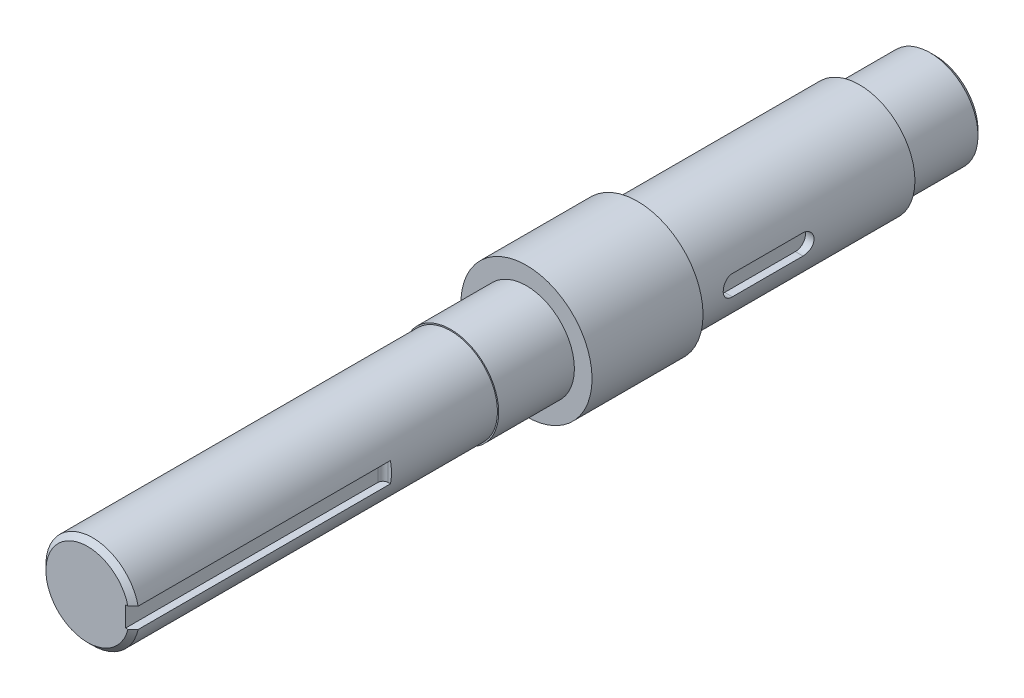
ISO-10303-21;
HEADER;
FILE_DESCRIPTION(('STEP AP214'),'2;1');
FILE_NAME('part.step','',(''),(''),'','','');
FILE_SCHEMA(('AUTOMOTIVE_DESIGN { 1 0 10303 214 1 1 1 1 }'));
ENDSEC;
DATA;
#1=APPLICATION_CONTEXT('core data for automotive mechanical design processes');
#2=APPLICATION_PROTOCOL_DEFINITION('international standard','automotive_design',2000,#1);
#3=PRODUCT_CONTEXT('',#1,'mechanical');
#4=PRODUCT('Part','Part','',(#3));
#5=PRODUCT_RELATED_PRODUCT_CATEGORY('part','',(#4));
#6=PRODUCT_DEFINITION_FORMATION('','',#4);
#7=PRODUCT_DEFINITION_CONTEXT('part definition',#1,'design');
#8=PRODUCT_DEFINITION('design','',#6,#7);
#9=PRODUCT_DEFINITION_SHAPE('','',#8);
#10=(LENGTH_UNIT() NAMED_UNIT(*) SI_UNIT(.MILLI.,.METRE.));
#11=(NAMED_UNIT(*) PLANE_ANGLE_UNIT() SI_UNIT($,.RADIAN.));
#12=(NAMED_UNIT(*) SI_UNIT($,.STERADIAN.) SOLID_ANGLE_UNIT());
#13=UNCERTAINTY_MEASURE_WITH_UNIT(LENGTH_MEASURE(1.E-05),#10,'distance_accuracy_value','');
#14=(GEOMETRIC_REPRESENTATION_CONTEXT(3) GLOBAL_UNCERTAINTY_ASSIGNED_CONTEXT((#13)) GLOBAL_UNIT_ASSIGNED_CONTEXT((#10,
#11,#12)) REPRESENTATION_CONTEXT('',''));
#15=CARTESIAN_POINT('',(0.,0.,0.));
#16=DIRECTION('',(0.,0.,1.));
#17=DIRECTION('',(1.,0.,0.));
#18=AXIS2_PLACEMENT_3D('',#15,#16,#17);
#19=CARTESIAN_POINT('',(0.,0.,0.));
#20=DIRECTION('',(0.,0.,-1.));
#21=DIRECTION('',(-1.,0.,0.));
#22=AXIS2_PLACEMENT_3D('',#19,#20,#21);
#23=PLANE('',#22);
#24=DIRECTION('',(-1.,0.,0.));
#25=VECTOR('',#24,1.);
#26=CARTESIAN_POINT('',(7.55,2.,0.));
#27=LINE('',#26,#25);
#28=CARTESIAN_POINT('',(8.00390529679107,2.,0.));
#29=VERTEX_POINT('',#28);
#30=CARTESIAN_POINT('',(7.55,2.,0.));
#31=VERTEX_POINT('',#30);
#32=EDGE_CURVE('E168',#29,#31,#27,.T.);
#33=ORIENTED_EDGE('',*,*,#32,.F.);
#34=CARTESIAN_POINT('',(0.,0.,0.));
#35=DIRECTION('',(0.,0.,-1.));
#36=DIRECTION('',(-1.,0.,0.));
#37=AXIS2_PLACEMENT_3D('',#34,#35,#36);
#38=CIRCLE('',#37,8.25000000000001);
#39=CARTESIAN_POINT('',(8.00390529679107,-2.,0.));
#40=VERTEX_POINT('',#39);
#41=EDGE_CURVE('E309',#29,#40,#38,.F.);
#42=ORIENTED_EDGE('',*,*,#41,.T.);
#43=DIRECTION('',(1.,0.,0.));
#44=VECTOR('',#43,1.);
#45=CARTESIAN_POINT('',(7.55,-2.,0.));
#46=LINE('',#45,#44);
#47=CARTESIAN_POINT('',(7.55,-2.,0.));
#48=VERTEX_POINT('',#47);
#49=EDGE_CURVE('E176',#48,#40,#46,.T.);
#50=ORIENTED_EDGE('',*,*,#49,.F.);
#51=DIRECTION('',(0.,-1.,0.));
#52=VECTOR('',#51,1.);
#53=CARTESIAN_POINT('',(7.55,2.,0.));
#54=LINE('',#53,#52);
#55=EDGE_CURVE('E157',#31,#48,#54,.T.);
#56=ORIENTED_EDGE('',*,*,#55,.F.);
#57=EDGE_LOOP('',(#33,#42,#50,#56));
#58=FACE_BOUND('',#57,.T.);
#59=ADVANCED_FACE('F44',(#58),#23,.F.);
#60=CARTESIAN_POINT('',(0.,0.,0.));
#61=DIRECTION('',(0.,0.,1.));
#62=DIRECTION('',(1.,0.,0.));
#63=AXIS2_PLACEMENT_3D('',#60,#61,#62);
#64=CYLINDRICAL_SURFACE('',#63,9.25);
#65=DIRECTION('',(0.,0.,1.));
#66=VECTOR('',#65,1.);
#67=CARTESIAN_POINT('',(9.03119593409422,-2.,0.));
#68=LINE('',#67,#66);
#69=CARTESIAN_POINT('',(9.03119593409422,-2.,-51.));
#70=VERTEX_POINT('',#69);
#71=CARTESIAN_POINT('',(9.03119593409422,-2.,-0.999999999999997));
#72=VERTEX_POINT('',#71);
#73=EDGE_CURVE('E224',#70,#72,#68,.T.);
#74=ORIENTED_EDGE('',*,*,#73,.T.);
#75=CARTESIAN_POINT('',(0.,0.,-0.999999999999997));
#76=DIRECTION('',(0.,0.,-1.));
#77=DIRECTION('',(-1.,0.,0.));
#78=AXIS2_PLACEMENT_3D('',#75,#76,#77);
#79=CIRCLE('',#78,9.25);
#80=CARTESIAN_POINT('',(9.03119593409422,2.,-0.999999999999997));
#81=VERTEX_POINT('',#80);
#82=EDGE_CURVE('E287',#72,#81,#79,.T.);
#83=ORIENTED_EDGE('',*,*,#82,.T.);
#84=DIRECTION('',(0.,0.,1.));
#85=VECTOR('',#84,1.);
#86=CARTESIAN_POINT('',(9.03119593409422,2.,0.));
#87=LINE('',#86,#85);
#88=CARTESIAN_POINT('',(9.03119593409422,2.,-51.));
#89=VERTEX_POINT('',#88);
#90=EDGE_CURVE('E228',#81,#89,#87,.F.);
#91=ORIENTED_EDGE('',*,*,#90,.T.);
#92=CARTESIAN_POINT('',(0.,0.,-51.));
#93=DIRECTION('',(0.,0.,1.));
#94=DIRECTION('',(1.,0.,0.));
#95=AXIS2_PLACEMENT_3D('',#92,#93,#94);
#96=CIRCLE('',#95,9.25);
#97=EDGE_CURVE('E220',#70,#89,#96,.T.);
#98=ORIENTED_EDGE('',*,*,#97,.F.);
#99=EDGE_LOOP('',(#74,#83,#91,#98));
#100=FACE_BOUND('',#99,.T.);
#101=CARTESIAN_POINT('',(0.,0.,-72.));
#102=DIRECTION('',(0.,0.,1.));
#103=DIRECTION('',(1.,0.,0.));
#104=AXIS2_PLACEMENT_3D('',#101,#102,#103);
#105=CIRCLE('',#104,9.25);
#106=CARTESIAN_POINT('',(9.25,0.,-72.));
#107=VERTEX_POINT('',#106);
#108=EDGE_CURVE('E216',#107,#107,#105,.T.);
#109=ORIENTED_EDGE('',*,*,#108,.T.);
#110=EDGE_LOOP('',(#109));
#111=FACE_BOUND('',#110,.T.);
#112=ADVANCED_FACE('F334',(#100,#111),#64,.T.);
#113=CARTESIAN_POINT('',(-9.25,0.,-72.));
#114=DIRECTION('',(0.,0.,-1.));
#115=DIRECTION('',(-1.,0.,0.));
#116=AXIS2_PLACEMENT_3D('',#113,#114,#115);
#117=PLANE('',#116);
#118=ORIENTED_EDGE('',*,*,#108,.F.);
#119=EDGE_LOOP('',(#118));
#120=FACE_BOUND('',#119,.T.);
#121=CARTESIAN_POINT('',(0.,0.,-72.));
#122=DIRECTION('',(0.,0.,1.));
#123=DIRECTION('',(1.,0.,0.));
#124=AXIS2_PLACEMENT_3D('',#121,#122,#123);
#125=CIRCLE('',#124,9.5);
#126=CARTESIAN_POINT('',(9.5,0.,-72.));
#127=VERTEX_POINT('',#126);
#128=EDGE_CURVE('E212',#127,#127,#125,.T.);
#129=ORIENTED_EDGE('',*,*,#128,.T.);
#130=EDGE_LOOP('',(#129));
#131=FACE_BOUND('',#130,.T.);
#132=ADVANCED_FACE('F340',(#120,#131),#117,.F.);
#133=CARTESIAN_POINT('',(0.,0.,0.));
#134=DIRECTION('',(0.,0.,1.));
#135=DIRECTION('',(1.,0.,0.));
#136=AXIS2_PLACEMENT_3D('',#133,#134,#135);
#137=CYLINDRICAL_SURFACE('',#136,9.5);
#138=ORIENTED_EDGE('',*,*,#128,.F.);
#139=EDGE_LOOP('',(#138));
#140=FACE_BOUND('',#139,.T.);
#141=CARTESIAN_POINT('',(0.,0.,-87.));
#142=DIRECTION('',(0.,0.,1.));
#143=DIRECTION('',(1.,0.,0.));
#144=AXIS2_PLACEMENT_3D('',#141,#142,#143);
#145=CIRCLE('',#144,9.5);
#146=CARTESIAN_POINT('',(9.5,0.,-87.));
#147=VERTEX_POINT('',#146);
#148=EDGE_CURVE('E208',#147,#147,#145,.T.);
#149=ORIENTED_EDGE('',*,*,#148,.T.);
#150=EDGE_LOOP('',(#149));
#151=FACE_BOUND('',#150,.T.);
#152=ADVANCED_FACE('F347',(#140,#151),#137,.T.);
#153=CARTESIAN_POINT('',(-9.5,0.,-87.));
#154=DIRECTION('',(0.,0.,-1.));
#155=DIRECTION('',(-1.,0.,0.));
#156=AXIS2_PLACEMENT_3D('',#153,#154,#155);
#157=PLANE('',#156);
#158=ORIENTED_EDGE('',*,*,#148,.F.);
#159=EDGE_LOOP('',(#158));
#160=FACE_BOUND('',#159,.T.);
#161=CARTESIAN_POINT('',(0.,0.,-87.));
#162=DIRECTION('',(0.,0.,1.));
#163=DIRECTION('',(1.,0.,0.));
#164=AXIS2_PLACEMENT_3D('',#161,#162,#163);
#165=CIRCLE('',#164,13.);
#166=CARTESIAN_POINT('',(13.,0.,-87.));
#167=VERTEX_POINT('',#166);
#168=EDGE_CURVE('E204',#167,#167,#165,.T.);
#169=ORIENTED_EDGE('',*,*,#168,.T.);
#170=EDGE_LOOP('',(#169));
#171=FACE_BOUND('',#170,.T.);
#172=ADVANCED_FACE('F351',(#160,#171),#157,.F.);
#173=CARTESIAN_POINT('',(0.,0.,0.));
#174=DIRECTION('',(0.,0.,1.));
#175=DIRECTION('',(1.,0.,0.));
#176=AXIS2_PLACEMENT_3D('',#173,#174,#175);
#177=CYLINDRICAL_SURFACE('',#176,13.);
#178=ORIENTED_EDGE('',*,*,#168,.F.);
#179=EDGE_LOOP('',(#178));
#180=FACE_BOUND('',#179,.T.);
#181=CARTESIAN_POINT('',(0.,0.,-109.));
#182=DIRECTION('',(0.,0.,1.));
#183=DIRECTION('',(1.,0.,0.));
#184=AXIS2_PLACEMENT_3D('',#181,#182,#183);
#185=CIRCLE('',#184,13.);
#186=CARTESIAN_POINT('',(13.,0.,-109.));
#187=VERTEX_POINT('',#186);
#188=EDGE_CURVE('E200',#187,#187,#185,.T.);
#189=ORIENTED_EDGE('',*,*,#188,.T.);
#190=EDGE_LOOP('',(#189));
#191=FACE_BOUND('',#190,.T.);
#192=ADVANCED_FACE('F355',(#180,#191),#177,.T.);
#193=CARTESIAN_POINT('',(-13.,0.,-109.));
#194=DIRECTION('',(0.,0.,1.));
#195=DIRECTION('',(1.,0.,0.));
#196=AXIS2_PLACEMENT_3D('',#193,#194,#195);
#197=PLANE('',#196);
#198=ORIENTED_EDGE('',*,*,#188,.F.);
#199=EDGE_LOOP('',(#198));
#200=FACE_BOUND('',#199,.T.);
#201=CARTESIAN_POINT('',(0.,0.,-109.));
#202=DIRECTION('',(0.,0.,1.));
#203=DIRECTION('',(1.,0.,0.));
#204=AXIS2_PLACEMENT_3D('',#201,#202,#203);
#205=CIRCLE('',#204,11.);
#206=CARTESIAN_POINT('',(11.,0.,-109.));
#207=VERTEX_POINT('',#206);
#208=EDGE_CURVE('E196',#207,#207,#205,.T.);
#209=ORIENTED_EDGE('',*,*,#208,.T.);
#210=EDGE_LOOP('',(#209));
#211=FACE_BOUND('',#210,.T.);
#212=ADVANCED_FACE('F358',(#200,#211),#197,.F.);
#213=CARTESIAN_POINT('',(0.,0.,0.));
#214=DIRECTION('',(0.,0.,1.));
#215=DIRECTION('',(1.,0.,0.));
#216=AXIS2_PLACEMENT_3D('',#213,#214,#215);
#217=CYLINDRICAL_SURFACE('',#216,11.);
#218=DIRECTION('',(0.,0.,1.));
#219=VECTOR('',#218,1.);
#220=CARTESIAN_POINT('',(10.816653826392,-2.,0.));
#221=LINE('',#220,#219);
#222=CARTESIAN_POINT('',(10.816653826392,-2.,-131.));
#223=VERTEX_POINT('',#222);
#224=CARTESIAN_POINT('',(10.816653826392,-2.,-117.));
#225=VERTEX_POINT('',#224);
#226=EDGE_CURVE('E321',#223,#225,#221,.T.);
#227=ORIENTED_EDGE('',*,*,#226,.T.);
#228=CARTESIAN_POINT('',(10.816653826392,-2.,-117.));
#229=CARTESIAN_POINT('',(10.816651258914,-2.00000018061634,-116.94422806179));
#230=CARTESIAN_POINT('',(10.8170857257361,-1.99766564189374,-116.888483307638));
#231=CARTESIAN_POINT('',(10.8188018840597,-1.98835585116647,-116.77740195715));
#232=CARTESIAN_POINT('',(10.8200834821592,-1.98138111077478,-116.722065316498));
#233=CARTESIAN_POINT('',(10.8251511920414,-1.95358097793237,-116.557428897521));
#234=CARTESIAN_POINT('',(10.8301604591789,-1.92587936906751,-116.449246575579));
#235=CARTESIAN_POINT('',(10.8428701687926,-1.85297540358901,-116.239167889975));
#236=CARTESIAN_POINT('',(10.8505710757285,-1.80777002644227,-116.137272614756));
#237=CARTESIAN_POINT('',(10.8677925398683,-1.70117309929226,-115.942488301224));
#238=CARTESIAN_POINT('',(10.8773131921923,-1.63978070311046,-115.849599734083));
#239=CARTESIAN_POINT('',(10.8972242664715,-1.50179830833211,-115.67441910933));
#240=CARTESIAN_POINT('',(10.907622686189,-1.42505726961891,-115.592246965078));
#241=CARTESIAN_POINT('',(10.9280480310746,-1.25887349016363,-115.441860980772));
#242=CARTESIAN_POINT('',(10.9380748988687,-1.16942879797534,-115.373649289161));
#243=CARTESIAN_POINT('',(10.9567125004528,-0.97959074459269,-115.252670876904));
#244=CARTESIAN_POINT('',(10.9653126265614,-0.879123860827199,-115.200017756166));
#245=CARTESIAN_POINT('',(10.9800371178379,-0.670593727576967,-115.112384733669));
#246=CARTESIAN_POINT('',(10.9861618124014,-0.562531491023177,-115.077402480364));
#247=CARTESIAN_POINT('',(10.9951890525403,-0.343126126847998,-115.026473059217));
#248=CARTESIAN_POINT('',(10.9981260767462,-0.231831754809527,-115.010322063021));
#249=CARTESIAN_POINT('',(11.0005658200381,-0.0080741245845282,-114.996878772328));
#250=CARTESIAN_POINT('',(11.0000687341353,0.104389066866689,-114.999585406972));
#251=CARTESIAN_POINT('',(10.9957231782306,0.325889572271524,-115.023624179995));
#252=CARTESIAN_POINT('',(10.9919142825436,0.434951642726337,-115.044736389689));
#253=CARTESIAN_POINT('',(10.981417423868,0.647958197325631,-115.104639468903));
#254=CARTESIAN_POINT('',(10.9747293801769,0.751902537929274,-115.14343083397));
#255=CARTESIAN_POINT('',(10.9591590664214,0.952367985634635,-115.237803859247));
#256=CARTESIAN_POINT('',(10.9502652164866,1.04884627383009,-115.293474485543));
#257=CARTESIAN_POINT('',(10.9312686142379,1.23117066093661,-115.419958494387));
#258=CARTESIAN_POINT('',(10.9211657884069,1.31701611262433,-115.490772798019));
#259=CARTESIAN_POINT('',(10.9007004580746,1.47693363459026,-115.646737494747));
#260=CARTESIAN_POINT('',(10.8903363063026,1.55081969037311,-115.732078500144));
#261=CARTESIAN_POINT('',(10.8706521448259,1.68327703651511,-115.914069686334));
#262=CARTESIAN_POINT('',(10.8613324290478,1.74184402191302,-116.010723035097));
#263=CARTESIAN_POINT('',(10.8447889040507,1.84205005134385,-116.21284701707));
#264=CARTESIAN_POINT('',(10.8375695040655,1.88365355603979,-116.318335609233));
#265=CARTESIAN_POINT('',(10.8261116120234,1.94843731479773,-116.534895164335));
#266=CARTESIAN_POINT('',(10.8218686733341,1.97164505765592,-116.645957533283));
#267=CARTESIAN_POINT('',(10.8184599236414,1.99021053132189,-116.798236341417));
#268=CARTESIAN_POINT('',(10.8177833008864,1.99388300652338,-116.838534153267));
#269=CARTESIAN_POINT('',(10.8168806740202,1.99877459457026,-116.919215355627));
#270=CARTESIAN_POINT('',(10.8166539128778,1.99999782905127,-116.959598487689));
#271=CARTESIAN_POINT('',(10.816653826392,2.,-117.));
#272=B_SPLINE_CURVE_WITH_KNOTS('',3,(#228,#229,#230,#231,#232,#233,#234,#235,#236,#237,#238,
#239,#240,#241,#242,#243,#244,#245,#246,#247,#248,#249,#250,#251,#252,#253,#254,#255,#256,#257,
#258,#259,#260,#261,#262,#263,#264,#265,#266,#267,#268,#269,#270,#271),.UNSPECIFIED.,.F.,.F.,(4,
2,2,2,2,2,2,2,2,2,2,2,2,2,2,2,2,2,2,2,2,4),(0.,0.167211555817646,0.334404678508456,
0.668032690697008,1.00171830099124,1.3354213582039,1.6725859449139,2.00980238061477,
2.34942336653652,2.68899914557081,3.02486421591156,3.36071021380238,3.69259734638405,
4.02449378235842,4.35817089733143,4.69186831333993,5.03033996174505,5.36890662542208,
5.7081790029471,6.04694344478351,6.16829654969758,6.28944526674888),.UNSPECIFIED.);
#273=CARTESIAN_POINT('',(10.816653826392,2.,-117.));
#274=VERTEX_POINT('',#273);
#275=EDGE_CURVE('E231',#225,#274,#272,.T.);
#276=ORIENTED_EDGE('',*,*,#275,.T.);
#277=DIRECTION('',(0.,0.,1.));
#278=VECTOR('',#277,1.);
#279=CARTESIAN_POINT('',(10.816653826392,2.,0.));
#280=LINE('',#279,#278);
#281=CARTESIAN_POINT('',(10.816653826392,2.,-131.));
#282=VERTEX_POINT('',#281);
#283=EDGE_CURVE('E324',#274,#282,#280,.F.);
#284=ORIENTED_EDGE('',*,*,#283,.T.);
#285=CARTESIAN_POINT('',(10.816653826392,2.,-131.));
#286=CARTESIAN_POINT('',(10.816651258914,2.00000018061634,-131.05577193821));
#287=CARTESIAN_POINT('',(10.8170857257361,1.99766564189373,-131.111516692362));
#288=CARTESIAN_POINT('',(10.8188018840597,1.98835585116647,-131.22259804285));
#289=CARTESIAN_POINT('',(10.8200834821592,1.98138111077478,-131.277934683502));
#290=CARTESIAN_POINT('',(10.8251511920414,1.95358097793237,-131.442571102479));
#291=CARTESIAN_POINT('',(10.8301604591789,1.9258793690675,-131.550753424421));
#292=CARTESIAN_POINT('',(10.8428701687926,1.852975403589,-131.760832110025));
#293=CARTESIAN_POINT('',(10.8505710757285,1.80777002644226,-131.862727385244));
#294=CARTESIAN_POINT('',(10.8677925398683,1.70117309929225,-132.057511698777));
#295=CARTESIAN_POINT('',(10.8773131921923,1.63978070311045,-132.150400265917));
#296=CARTESIAN_POINT('',(10.8972242664715,1.5017983083321,-132.32558089067));
#297=CARTESIAN_POINT('',(10.907622686189,1.4250572696189,-132.407753034922));
#298=CARTESIAN_POINT('',(10.9280480310746,1.25887349016362,-132.558139019228));
#299=CARTESIAN_POINT('',(10.9380748988687,1.16942879797533,-132.626350710839));
#300=CARTESIAN_POINT('',(10.9567125004528,0.979590744592674,-132.747329123096));
#301=CARTESIAN_POINT('',(10.9653126265614,0.879123860827184,-132.799982243834));
#302=CARTESIAN_POINT('',(10.9800371178379,0.670593727576952,-132.887615266331));
#303=CARTESIAN_POINT('',(10.9861618124014,0.562531491023159,-132.922597519636));
#304=CARTESIAN_POINT('',(10.9951890525403,0.343126126847981,-132.973526940783));
#305=CARTESIAN_POINT('',(10.9981260767462,0.231831754809513,-132.989677936979));
#306=CARTESIAN_POINT('',(11.0005658200381,0.00807412458451988,-133.003121227672));
#307=CARTESIAN_POINT('',(11.0000687341353,-0.104389066866695,-133.000414593028));
#308=CARTESIAN_POINT('',(10.9957231782306,-0.325889572271526,-132.976375820005));
#309=CARTESIAN_POINT('',(10.9919142825436,-0.434951642726337,-132.955263610311));
#310=CARTESIAN_POINT('',(10.981417423868,-0.647958197325633,-132.895360531098));
#311=CARTESIAN_POINT('',(10.9747293801769,-0.751902537929278,-132.85656916603));
#312=CARTESIAN_POINT('',(10.9591590664214,-0.952367985634642,-132.762196140753));
#313=CARTESIAN_POINT('',(10.9502652164866,-1.0488462738301,-132.706525514457));
#314=CARTESIAN_POINT('',(10.9312686142379,-1.23117066093661,-132.580041505613));
#315=CARTESIAN_POINT('',(10.9211657884069,-1.31701611262433,-132.509227201981));
#316=CARTESIAN_POINT('',(10.9007004580746,-1.47693363459026,-132.353262505253));
#317=CARTESIAN_POINT('',(10.8903363063026,-1.55081969037311,-132.267921499856));
#318=CARTESIAN_POINT('',(10.8706521448259,-1.68327703651512,-132.085930313666));
#319=CARTESIAN_POINT('',(10.8613324290478,-1.74184402191302,-131.989276964903));
#320=CARTESIAN_POINT('',(10.8447889040507,-1.84205005134386,-131.78715298293));
#321=CARTESIAN_POINT('',(10.8375695040655,-1.8836535560398,-131.681664390767));
#322=CARTESIAN_POINT('',(10.8261116120234,-1.94843731479774,-131.465104835665));
#323=CARTESIAN_POINT('',(10.8218686733341,-1.97164505765593,-131.354042466717));
#324=CARTESIAN_POINT('',(10.8184599236414,-1.9902105313219,-131.201763658583));
#325=CARTESIAN_POINT('',(10.8177833008864,-1.99388300652339,-131.161465846733));
#326=CARTESIAN_POINT('',(10.8168806740201,-1.99877459457026,-131.080784644373));
#327=CARTESIAN_POINT('',(10.8166539128778,-1.99999782905128,-131.040401512311));
#328=CARTESIAN_POINT('',(10.816653826392,-2.,-131.));
#329=B_SPLINE_CURVE_WITH_KNOTS('',3,(#285,#286,#287,#288,#289,#290,#291,#292,#293,#294,#295,
#296,#297,#298,#299,#300,#301,#302,#303,#304,#305,#306,#307,#308,#309,#310,#311,#312,#313,#314,
#315,#316,#317,#318,#319,#320,#321,#322,#323,#324,#325,#326,#327,#328),.UNSPECIFIED.,.F.,.F.,(4,
2,2,2,2,2,2,2,2,2,2,2,2,2,2,2,2,2,2,2,2,4),(0.,0.167211555817618,0.334404678508414,
0.668032690697008,1.00171830099127,1.33542135820391,1.6725859449139,2.00980238061477,
2.34942336653652,2.68899914557082,3.02486421591156,3.36071021380238,3.69259734638404,
4.02449378235842,4.35817089733143,4.69186831333993,5.03033996174504,5.36890662542208,
5.70817900294709,6.0469434447835,6.1682965496976,6.28944526674888),.UNSPECIFIED.);
#330=EDGE_CURVE('E128',#282,#223,#329,.T.);
#331=ORIENTED_EDGE('',*,*,#330,.T.);
#332=EDGE_LOOP('',(#227,#276,#284,#331));
#333=FACE_BOUND('',#332,.T.);
#334=ORIENTED_EDGE('',*,*,#208,.F.);
#335=EDGE_LOOP('',(#334));
#336=FACE_BOUND('',#335,.T.);
#337=CARTESIAN_POINT('',(0.,0.,-153.));
#338=DIRECTION('',(0.,0.,1.));
#339=DIRECTION('',(1.,0.,0.));
#340=AXIS2_PLACEMENT_3D('',#337,#338,#339);
#341=CIRCLE('',#340,11.);
#342=CARTESIAN_POINT('',(11.,0.,-153.));
#343=VERTEX_POINT('',#342);
#344=EDGE_CURVE('E192',#343,#343,#341,.T.);
#345=ORIENTED_EDGE('',*,*,#344,.T.);
#346=EDGE_LOOP('',(#345));
#347=FACE_BOUND('',#346,.T.);
#348=ADVANCED_FACE('F247',(#333,#336,#347),#217,.T.);
#349=CARTESIAN_POINT('',(-11.,0.,-153.));
#350=DIRECTION('',(0.,0.,1.));
#351=DIRECTION('',(1.,0.,0.));
#352=AXIS2_PLACEMENT_3D('',#349,#350,#351);
#353=PLANE('',#352);
#354=ORIENTED_EDGE('',*,*,#344,.F.);
#355=EDGE_LOOP('',(#354));
#356=FACE_BOUND('',#355,.T.);
#357=CARTESIAN_POINT('',(0.,0.,-153.));
#358=DIRECTION('',(0.,0.,1.));
#359=DIRECTION('',(1.,0.,0.));
#360=AXIS2_PLACEMENT_3D('',#357,#358,#359);
#361=CIRCLE('',#360,9.5);
#362=CARTESIAN_POINT('',(9.5,0.,-153.));
#363=VERTEX_POINT('',#362);
#364=EDGE_CURVE('E186',#363,#363,#361,.T.);
#365=ORIENTED_EDGE('',*,*,#364,.T.);
#366=EDGE_LOOP('',(#365));
#367=FACE_BOUND('',#366,.T.);
#368=ADVANCED_FACE('F365',(#356,#367),#353,.F.);
#369=CARTESIAN_POINT('',(0.,0.,0.));
#370=DIRECTION('',(0.,0.,1.));
#371=DIRECTION('',(1.,0.,0.));
#372=AXIS2_PLACEMENT_3D('',#369,#370,#371);
#373=CYLINDRICAL_SURFACE('',#372,9.5);
#374=CARTESIAN_POINT('',(0.,0.,-167.));
#375=DIRECTION('',(0.,0.,1.));
#376=DIRECTION('',(1.,0.,0.));
#377=AXIS2_PLACEMENT_3D('',#374,#375,#376);
#378=CIRCLE('',#377,9.5);
#379=CARTESIAN_POINT('',(9.5,0.,-167.));
#380=VERTEX_POINT('',#379);
#381=EDGE_CURVE('E317',#380,#380,#378,.T.);
#382=ORIENTED_EDGE('',*,*,#381,.T.);
#383=EDGE_LOOP('',(#382));
#384=FACE_BOUND('',#383,.T.);
#385=ORIENTED_EDGE('',*,*,#364,.F.);
#386=EDGE_LOOP('',(#385));
#387=FACE_BOUND('',#386,.T.);
#388=ADVANCED_FACE('F374',(#384,#387),#373,.T.);
#389=CARTESIAN_POINT('',(-9.5,0.,-168.));
#390=DIRECTION('',(0.,0.,1.));
#391=DIRECTION('',(1.,0.,0.));
#392=AXIS2_PLACEMENT_3D('',#389,#390,#391);
#393=PLANE('',#392);
#394=CARTESIAN_POINT('',(0.,0.,-168.));
#395=DIRECTION('',(0.,0.,1.));
#396=DIRECTION('',(1.,0.,0.));
#397=AXIS2_PLACEMENT_3D('',#394,#395,#396);
#398=CIRCLE('',#397,8.50000000000005);
#399=CARTESIAN_POINT('',(8.50000000000005,0.,-168.));
#400=VERTEX_POINT('',#399);
#401=EDGE_CURVE('E313',#400,#400,#398,.F.);
#402=ORIENTED_EDGE('',*,*,#401,.T.);
#403=EDGE_LOOP('',(#402));
#404=FACE_BOUND('',#403,.T.);
#405=ADVANCED_FACE('F273',(#404),#393,.F.);
#406=CARTESIAN_POINT('',(7.55,2.,-51.));
#407=DIRECTION('',(0.,1.,0.));
#408=DIRECTION('',(0.,0.,1.));
#409=AXIS2_PLACEMENT_3D('',#406,#407,#408);
#410=PLANE('',#409);
#411=DIRECTION('',(0.,0.,1.));
#412=VECTOR('',#411,1.);
#413=CARTESIAN_POINT('',(7.55,2.,-51.));
#414=LINE('',#413,#412);
#415=CARTESIAN_POINT('',(7.55,2.,-50.));
#416=VERTEX_POINT('',#415);
#417=EDGE_CURVE('E183',#416,#31,#414,.T.);
#418=ORIENTED_EDGE('',*,*,#417,.F.);
#419=CARTESIAN_POINT('',(8.55,2.,-50.));
#420=DIRECTION('',(0.,1.,0.));
#421=DIRECTION('',(0.,0.,1.));
#422=AXIS2_PLACEMENT_3D('',#419,#420,#421);
#423=CIRCLE('',#422,1.);
#424=CARTESIAN_POINT('',(8.55,2.,-51.));
#425=VERTEX_POINT('',#424);
#426=EDGE_CURVE('E11',#416,#425,#423,.F.);
#427=ORIENTED_EDGE('',*,*,#426,.T.);
#428=DIRECTION('',(-1.,0.,0.));
#429=VECTOR('',#428,1.);
#430=CARTESIAN_POINT('',(7.55,2.,-51.));
#431=LINE('',#430,#429);
#432=EDGE_CURVE('E167',#89,#425,#431,.T.);
#433=ORIENTED_EDGE('',*,*,#432,.F.);
#434=ORIENTED_EDGE('',*,*,#90,.F.);
#435=CARTESIAN_POINT('',(9.03119593409422,2.,-0.999999999999997));
#436=CARTESIAN_POINT('',(8.86024419622444,2.,-0.833062789716138));
#437=CARTESIAN_POINT('',(8.6891607772396,2.,-0.666260854208873));
#438=CARTESIAN_POINT('',(8.34673056482401,2.,-0.332927520856238));
#439=CARTESIAN_POINT('',(8.17538377137446,2.,-0.166396123030169));
#440=CARTESIAN_POINT('',(8.00390529679107,2.,0.));
#441=B_SPLINE_CURVE_WITH_KNOTS('',3,(#435,#436,#437,#438,#439,#440),.UNSPECIFIED.,.F.,.F.,(4,2,
4),(0.,0.716820617354577,1.43364128585271),.UNSPECIFIED.);
#442=EDGE_CURVE('E278',#81,#29,#441,.T.);
#443=ORIENTED_EDGE('',*,*,#442,.T.);
#444=ORIENTED_EDGE('',*,*,#32,.T.);
#445=EDGE_LOOP('',(#418,#427,#433,#434,#443,#444));
#446=FACE_BOUND('',#445,.T.);
#447=ADVANCED_FACE('F269',(#446),#410,.F.);
#448=CARTESIAN_POINT('',(7.55,-2.,-51.));
#449=DIRECTION('',(0.,-1.,0.));
#450=DIRECTION('',(0.,0.,-1.));
#451=AXIS2_PLACEMENT_3D('',#448,#449,#450);
#452=PLANE('',#451);
#453=DIRECTION('',(1.,0.,0.));
#454=VECTOR('',#453,1.);
#455=CARTESIAN_POINT('',(7.55,-2.,-51.));
#456=LINE('',#455,#454);
#457=CARTESIAN_POINT('',(8.55,-2.,-51.));
#458=VERTEX_POINT('',#457);
#459=EDGE_CURVE('E164',#458,#70,#456,.T.);
#460=ORIENTED_EDGE('',*,*,#459,.F.);
#461=CARTESIAN_POINT('',(8.55,-2.,-50.));
#462=DIRECTION('',(0.,-1.,0.));
#463=DIRECTION('',(0.,0.,-1.));
#464=AXIS2_PLACEMENT_3D('',#461,#462,#463);
#465=CIRCLE('',#464,1.);
#466=CARTESIAN_POINT('',(7.55,-2.,-50.));
#467=VERTEX_POINT('',#466);
#468=EDGE_CURVE('E67',#458,#467,#465,.F.);
#469=ORIENTED_EDGE('',*,*,#468,.T.);
#470=DIRECTION('',(0.,0.,1.));
#471=VECTOR('',#470,1.);
#472=CARTESIAN_POINT('',(7.55,-2.,-51.));
#473=LINE('',#472,#471);
#474=EDGE_CURVE('E172',#467,#48,#473,.T.);
#475=ORIENTED_EDGE('',*,*,#474,.T.);
#476=ORIENTED_EDGE('',*,*,#49,.T.);
#477=CARTESIAN_POINT('',(8.00390529679107,-2.,0.));
#478=CARTESIAN_POINT('',(8.17538377137446,-2.,-0.16639612303017));
#479=CARTESIAN_POINT('',(8.34673056482401,-2.,-0.332927520856238));
#480=CARTESIAN_POINT('',(8.6891607772396,-2.,-0.666260854208873));
#481=CARTESIAN_POINT('',(8.86024419622444,-2.,-0.833062789716138));
#482=CARTESIAN_POINT('',(9.03119593409422,-2.,-0.999999999999997));
#483=B_SPLINE_CURVE_WITH_KNOTS('',3,(#477,#478,#479,#480,#481,#482),.UNSPECIFIED.,.F.,.F.,(4,2,
4),(0.,0.716820668498136,1.43364128585271),.UNSPECIFIED.);
#484=EDGE_CURVE('E302',#40,#72,#483,.T.);
#485=ORIENTED_EDGE('',*,*,#484,.T.);
#486=ORIENTED_EDGE('',*,*,#73,.F.);
#487=EDGE_LOOP('',(#460,#469,#475,#476,#485,#486));
#488=FACE_BOUND('',#487,.T.);
#489=ADVANCED_FACE('F267',(#488),#452,.F.);
#490=CARTESIAN_POINT('',(0.,0.,-51.));
#491=DIRECTION('',(0.,0.,1.));
#492=DIRECTION('',(1.,0.,0.));
#493=AXIS2_PLACEMENT_3D('',#490,#491,#492);
#494=PLANE('',#493);
#495=ORIENTED_EDGE('',*,*,#432,.T.);
#496=DIRECTION('',(0.,-1.,0.));
#497=VECTOR('',#496,1.);
#498=CARTESIAN_POINT('',(8.55,0.,-51.));
#499=LINE('',#498,#497);
#500=EDGE_CURVE('E286',#425,#458,#499,.T.);
#501=ORIENTED_EDGE('',*,*,#500,.T.);
#502=ORIENTED_EDGE('',*,*,#459,.T.);
#503=ORIENTED_EDGE('',*,*,#97,.T.);
#504=EDGE_LOOP('',(#495,#501,#502,#503));
#505=FACE_BOUND('',#504,.T.);
#506=ADVANCED_FACE('F264',(#505),#494,.T.);
#507=CARTESIAN_POINT('',(7.55,2.,-51.));
#508=DIRECTION('',(-1.,0.,0.));
#509=DIRECTION('',(0.,0.,1.));
#510=AXIS2_PLACEMENT_3D('',#507,#508,#509);
#511=PLANE('',#510);
#512=ORIENTED_EDGE('',*,*,#474,.F.);
#513=DIRECTION('',(0.,-1.,0.));
#514=VECTOR('',#513,1.);
#515=CARTESIAN_POINT('',(7.55,2.,-50.));
#516=LINE('',#515,#514);
#517=EDGE_CURVE('E53',#467,#416,#516,.F.);
#518=ORIENTED_EDGE('',*,*,#517,.T.);
#519=ORIENTED_EDGE('',*,*,#417,.T.);
#520=ORIENTED_EDGE('',*,*,#55,.T.);
#521=EDGE_LOOP('',(#512,#518,#519,#520));
#522=FACE_BOUND('',#521,.T.);
#523=ADVANCED_FACE('F263',(#522),#511,.F.);
#524=CARTESIAN_POINT('',(9.3,0.,-131.));
#525=DIRECTION('',(1.,0.,0.));
#526=DIRECTION('',(0.,0.,-1.));
#527=AXIS2_PLACEMENT_3D('',#524,#525,#526);
#528=CYLINDRICAL_SURFACE('',#527,2.);
#529=DIRECTION('',(1.,0.,0.));
#530=VECTOR('',#529,1.);
#531=CARTESIAN_POINT('',(9.3,2.,-131.));
#532=LINE('',#531,#530);
#533=CARTESIAN_POINT('',(9.3,2.,-131.));
#534=VERTEX_POINT('',#533);
#535=EDGE_CURVE('E120',#534,#282,#532,.T.);
#536=ORIENTED_EDGE('',*,*,#535,.F.);
#537=CARTESIAN_POINT('',(9.3,0.,-131.));
#538=DIRECTION('',(1.,0.,0.));
#539=DIRECTION('',(0.,0.,-1.));
#540=AXIS2_PLACEMENT_3D('',#537,#538,#539);
#541=CIRCLE('',#540,2.);
#542=CARTESIAN_POINT('',(9.3,-2.,-131.));
#543=VERTEX_POINT('',#542);
#544=EDGE_CURVE('E125',#543,#534,#541,.T.);
#545=ORIENTED_EDGE('',*,*,#544,.F.);
#546=DIRECTION('',(1.,0.,0.));
#547=VECTOR('',#546,1.);
#548=CARTESIAN_POINT('',(9.3,-2.,-131.));
#549=LINE('',#548,#547);
#550=EDGE_CURVE('E154',#543,#223,#549,.T.);
#551=ORIENTED_EDGE('',*,*,#550,.T.);
#552=ORIENTED_EDGE('',*,*,#330,.F.);
#553=EDGE_LOOP('',(#536,#545,#551,#552));
#554=FACE_BOUND('',#553,.T.);
#555=ADVANCED_FACE('F122',(#554),#528,.F.);
#556=CARTESIAN_POINT('',(9.3,-2.,-117.));
#557=DIRECTION('',(0.,-1.,0.));
#558=DIRECTION('',(0.,0.,-1.));
#559=AXIS2_PLACEMENT_3D('',#556,#557,#558);
#560=PLANE('',#559);
#561=ORIENTED_EDGE('',*,*,#550,.F.);
#562=DIRECTION('',(0.,0.,-1.));
#563=VECTOR('',#562,1.);
#564=CARTESIAN_POINT('',(9.3,-2.,-117.));
#565=LINE('',#564,#563);
#566=CARTESIAN_POINT('',(9.3,-2.,-117.));
#567=VERTEX_POINT('',#566);
#568=EDGE_CURVE('E133',#567,#543,#565,.T.);
#569=ORIENTED_EDGE('',*,*,#568,.F.);
#570=DIRECTION('',(1.,0.,0.));
#571=VECTOR('',#570,1.);
#572=CARTESIAN_POINT('',(9.3,-2.,-117.));
#573=LINE('',#572,#571);
#574=EDGE_CURVE('E158',#567,#225,#573,.T.);
#575=ORIENTED_EDGE('',*,*,#574,.T.);
#576=ORIENTED_EDGE('',*,*,#226,.F.);
#577=EDGE_LOOP('',(#561,#569,#575,#576));
#578=FACE_BOUND('',#577,.T.);
#579=ADVANCED_FACE('F256',(#578),#560,.F.);
#580=CARTESIAN_POINT('',(9.3,0.,-117.));
#581=DIRECTION('',(1.,0.,0.));
#582=DIRECTION('',(0.,0.,-1.));
#583=AXIS2_PLACEMENT_3D('',#580,#581,#582);
#584=CYLINDRICAL_SURFACE('',#583,2.);
#585=ORIENTED_EDGE('',*,*,#574,.F.);
#586=CARTESIAN_POINT('',(9.3,0.,-117.));
#587=DIRECTION('',(1.,0.,0.));
#588=DIRECTION('',(0.,0.,1.));
#589=AXIS2_PLACEMENT_3D('',#586,#587,#588);
#590=CIRCLE('',#589,2.);
#591=CARTESIAN_POINT('',(9.3,2.,-117.));
#592=VERTEX_POINT('',#591);
#593=EDGE_CURVE('E143',#592,#567,#590,.T.);
#594=ORIENTED_EDGE('',*,*,#593,.F.);
#595=DIRECTION('',(1.,0.,0.));
#596=VECTOR('',#595,1.);
#597=CARTESIAN_POINT('',(9.3,2.,-117.));
#598=LINE('',#597,#596);
#599=EDGE_CURVE('E132',#592,#274,#598,.T.);
#600=ORIENTED_EDGE('',*,*,#599,.T.);
#601=ORIENTED_EDGE('',*,*,#275,.F.);
#602=EDGE_LOOP('',(#585,#594,#600,#601));
#603=FACE_BOUND('',#602,.T.);
#604=ADVANCED_FACE('F251',(#603),#584,.F.);
#605=CARTESIAN_POINT('',(9.3,2.,-117.));
#606=DIRECTION('',(0.,1.,0.));
#607=DIRECTION('',(0.,0.,1.));
#608=AXIS2_PLACEMENT_3D('',#605,#606,#607);
#609=PLANE('',#608);
#610=ORIENTED_EDGE('',*,*,#599,.F.);
#611=DIRECTION('',(0.,0.,1.));
#612=VECTOR('',#611,1.);
#613=CARTESIAN_POINT('',(9.3,2.,-117.));
#614=LINE('',#613,#612);
#615=EDGE_CURVE('E136',#534,#592,#614,.T.);
#616=ORIENTED_EDGE('',*,*,#615,.F.);
#617=ORIENTED_EDGE('',*,*,#535,.T.);
#618=ORIENTED_EDGE('',*,*,#283,.F.);
#619=EDGE_LOOP('',(#610,#616,#617,#618));
#620=FACE_BOUND('',#619,.T.);
#621=ADVANCED_FACE('F137',(#620),#609,.F.);
#622=CARTESIAN_POINT('',(9.3,0.,-131.));
#623=DIRECTION('',(1.,0.,0.));
#624=DIRECTION('',(0.,0.,-1.));
#625=AXIS2_PLACEMENT_3D('',#622,#623,#624);
#626=PLANE('',#625);
#627=ORIENTED_EDGE('',*,*,#544,.T.);
#628=ORIENTED_EDGE('',*,*,#615,.T.);
#629=ORIENTED_EDGE('',*,*,#593,.T.);
#630=ORIENTED_EDGE('',*,*,#568,.T.);
#631=EDGE_LOOP('',(#627,#628,#629,#630));
#632=FACE_BOUND('',#631,.T.);
#633=ADVANCED_FACE('F145',(#632),#626,.T.);
#634=CARTESIAN_POINT('',(0.,0.,-167.));
#635=DIRECTION('',(0.,0.,1.));
#636=DIRECTION('',(1.,0.,0.));
#637=AXIS2_PLACEMENT_3D('',#634,#635,#636);
#638=CONICAL_SURFACE('',#637,9.5,0.785398163397451);
#639=ORIENTED_EDGE('',*,*,#401,.F.);
#640=EDGE_LOOP('',(#639));
#641=FACE_BOUND('',#640,.T.);
#642=ORIENTED_EDGE('',*,*,#381,.F.);
#643=EDGE_LOOP('',(#642));
#644=FACE_BOUND('',#643,.T.);
#645=ADVANCED_FACE('F298',(#641,#644),#638,.T.);
#646=CARTESIAN_POINT('',(0.,0.,0.));
#647=DIRECTION('',(0.,0.,-1.));
#648=DIRECTION('',(-1.,0.,0.));
#649=AXIS2_PLACEMENT_3D('',#646,#647,#648);
#650=CONICAL_SURFACE('',#649,8.25000000000001,0.785398163397446);
#651=ORIENTED_EDGE('',*,*,#442,.F.);
#652=ORIENTED_EDGE('',*,*,#82,.F.);
#653=ORIENTED_EDGE('',*,*,#484,.F.);
#654=ORIENTED_EDGE('',*,*,#41,.F.);
#655=EDGE_LOOP('',(#651,#652,#653,#654));
#656=FACE_BOUND('',#655,.T.);
#657=ADVANCED_FACE('F291',(#656),#650,.T.);
#658=CARTESIAN_POINT('',(8.55,0.,-50.));
#659=DIRECTION('',(0.,-1.,0.));
#660=DIRECTION('',(0.,0.,-1.));
#661=AXIS2_PLACEMENT_3D('',#658,#659,#660);
#662=CYLINDRICAL_SURFACE('',#661,1.);
#663=ORIENTED_EDGE('',*,*,#426,.F.);
#664=ORIENTED_EDGE('',*,*,#517,.F.);
#665=ORIENTED_EDGE('',*,*,#468,.F.);
#666=ORIENTED_EDGE('',*,*,#500,.F.);
#667=EDGE_LOOP('',(#663,#664,#665,#666));
#668=FACE_BOUND('',#667,.T.);
#669=ADVANCED_FACE('F46',(#668),#662,.F.);
#670=CLOSED_SHELL('',(#59,#112,#132,#152,#172,#192,#212,#348,#368,#388,#405,#447,#489,#506,#523,
#555,#579,#604,#621,#633,#645,#657,#669));
#671=MANIFOLD_SOLID_BREP('B2',#670);
#672=ADVANCED_BREP_SHAPE_REPRESENTATION('',(#18,#671),#14);
#673=SHAPE_DEFINITION_REPRESENTATION(#9,#672);
ENDSEC;
END-ISO-10303-21;
